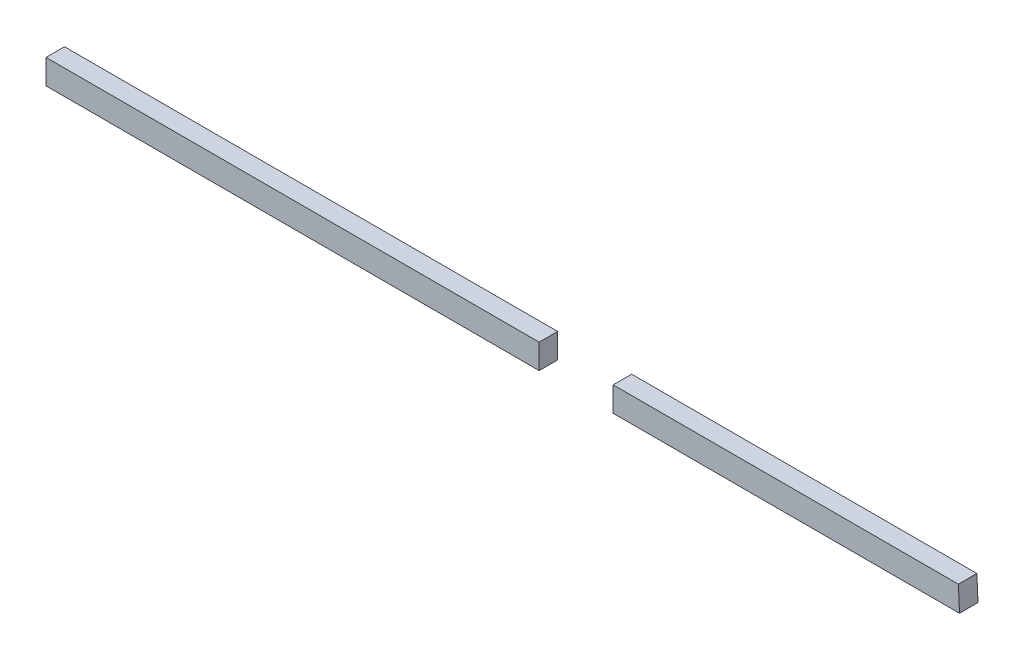
ISO-10303-21;
HEADER;
FILE_DESCRIPTION(('STEP AP214'),'2;1');
FILE_NAME('part.step','',(''),(''),'','','');
FILE_SCHEMA(('AUTOMOTIVE_DESIGN { 1 0 10303 214 1 1 1 1 }'));
ENDSEC;
DATA;
#1=APPLICATION_CONTEXT('core data for automotive mechanical design processes');
#2=APPLICATION_PROTOCOL_DEFINITION('international standard','automotive_design',2000,#1);
#3=PRODUCT_CONTEXT('',#1,'mechanical');
#4=PRODUCT('Part','Part','',(#3));
#5=PRODUCT_RELATED_PRODUCT_CATEGORY('part','',(#4));
#6=PRODUCT_DEFINITION_FORMATION('','',#4);
#7=PRODUCT_DEFINITION_CONTEXT('part definition',#1,'design');
#8=PRODUCT_DEFINITION('design','',#6,#7);
#9=PRODUCT_DEFINITION_SHAPE('','',#8);
#10=(LENGTH_UNIT() NAMED_UNIT(*) SI_UNIT(.MILLI.,.METRE.));
#11=(NAMED_UNIT(*) PLANE_ANGLE_UNIT() SI_UNIT($,.RADIAN.));
#12=(NAMED_UNIT(*) SI_UNIT($,.STERADIAN.) SOLID_ANGLE_UNIT());
#13=UNCERTAINTY_MEASURE_WITH_UNIT(LENGTH_MEASURE(1.E-05),#10,'distance_accuracy_value','');
#14=(GEOMETRIC_REPRESENTATION_CONTEXT(3) GLOBAL_UNCERTAINTY_ASSIGNED_CONTEXT((#13)) GLOBAL_UNIT_ASSIGNED_CONTEXT((#10,
#11,#12)) REPRESENTATION_CONTEXT('',''));
#15=CARTESIAN_POINT('',(0.,0.,0.));
#16=DIRECTION('',(0.,0.,1.));
#17=DIRECTION('',(1.,0.,0.));
#18=AXIS2_PLACEMENT_3D('',#15,#16,#17);
#19=CARTESIAN_POINT('',(-3.54461959474639,10.2044836135278,-1.5));
#20=DIRECTION('',(0.,1.,0.));
#21=DIRECTION('',(0.,0.,1.));
#22=AXIS2_PLACEMENT_3D('',#19,#20,#21);
#23=PLANE('',#22);
#24=DIRECTION('',(-1.,0.,0.));
#25=VECTOR('',#24,1.);
#26=CARTESIAN_POINT('',(-3.54461959474639,10.2044836135278,0.));
#27=LINE('',#26,#25);
#28=CARTESIAN_POINT('',(-3.54461959474639,10.2044836135278,0.));
#29=VERTEX_POINT('',#28);
#30=CARTESIAN_POINT('',(-31.5446195947464,10.2044836135278,0.));
#31=VERTEX_POINT('',#30);
#32=EDGE_CURVE('E106',#29,#31,#27,.T.);
#33=ORIENTED_EDGE('',*,*,#32,.F.);
#34=DIRECTION('',(0.,0.,1.));
#35=VECTOR('',#34,1.);
#36=CARTESIAN_POINT('',(-3.54461959474639,10.2044836135278,-1.5));
#37=LINE('',#36,#35);
#38=CARTESIAN_POINT('',(-3.54461959474639,10.2044836135278,-1.5));
#39=VERTEX_POINT('',#38);
#40=EDGE_CURVE('E12',#39,#29,#37,.T.);
#41=ORIENTED_EDGE('',*,*,#40,.F.);
#42=DIRECTION('',(-1.,0.,0.));
#43=VECTOR('',#42,1.);
#44=CARTESIAN_POINT('',(-3.54461959474639,10.2044836135278,-1.5));
#45=LINE('',#44,#43);
#46=CARTESIAN_POINT('',(-31.5446195947464,10.2044836135278,-1.5));
#47=VERTEX_POINT('',#46);
#48=EDGE_CURVE('E100',#39,#47,#45,.T.);
#49=ORIENTED_EDGE('',*,*,#48,.T.);
#50=DIRECTION('',(0.,0.,1.));
#51=VECTOR('',#50,1.);
#52=CARTESIAN_POINT('',(-31.5446195947464,10.2044836135278,-1.5));
#53=LINE('',#52,#51);
#54=EDGE_CURVE('E45',#47,#31,#53,.T.);
#55=ORIENTED_EDGE('',*,*,#54,.T.);
#56=EDGE_LOOP('',(#33,#41,#49,#55));
#57=FACE_BOUND('',#56,.T.);
#58=ADVANCED_FACE('F42',(#57),#23,.T.);
#59=CARTESIAN_POINT('',(-3.45483620429832,8.20448361352781,-1.5));
#60=DIRECTION('',(0.998993888280604,0.0448465291633645,0.));
#61=DIRECTION('',(-0.0448465291633645,0.998993888280604,0.));
#62=AXIS2_PLACEMENT_3D('',#59,#60,#61);
#63=PLANE('',#62);
#64=DIRECTION('',(-0.0448465291633645,0.998993888280604,0.));
#65=VECTOR('',#64,1.);
#66=CARTESIAN_POINT('',(-3.45483620429832,8.20448361352781,0.));
#67=LINE('',#66,#65);
#68=CARTESIAN_POINT('',(-3.45483620429832,8.20448361352781,0.));
#69=VERTEX_POINT('',#68);
#70=EDGE_CURVE('E102',#69,#29,#67,.T.);
#71=ORIENTED_EDGE('',*,*,#70,.F.);
#72=DIRECTION('',(0.,0.,1.));
#73=VECTOR('',#72,1.);
#74=CARTESIAN_POINT('',(-3.45483620429832,8.20448361352781,-1.5));
#75=LINE('',#74,#73);
#76=CARTESIAN_POINT('',(-3.45483620429832,8.20448361352781,-1.5));
#77=VERTEX_POINT('',#76);
#78=EDGE_CURVE('E51',#77,#69,#75,.T.);
#79=ORIENTED_EDGE('',*,*,#78,.F.);
#80=DIRECTION('',(-0.0448465291633645,0.998993888280604,0.));
#81=VECTOR('',#80,1.);
#82=CARTESIAN_POINT('',(-3.45483620429832,8.20448361352781,-1.5));
#83=LINE('',#82,#81);
#84=EDGE_CURVE('E97',#77,#39,#83,.T.);
#85=ORIENTED_EDGE('',*,*,#84,.T.);
#86=ORIENTED_EDGE('',*,*,#40,.T.);
#87=EDGE_LOOP('',(#71,#79,#85,#86));
#88=FACE_BOUND('',#87,.T.);
#89=ADVANCED_FACE('F116',(#88),#63,.T.);
#90=CARTESIAN_POINT('',(-31.5446195947464,8.20448361352781,-1.5));
#91=DIRECTION('',(0.,-1.,0.));
#92=DIRECTION('',(0.,0.,-1.));
#93=AXIS2_PLACEMENT_3D('',#90,#91,#92);
#94=PLANE('',#93);
#95=DIRECTION('',(1.,0.,0.));
#96=VECTOR('',#95,1.);
#97=CARTESIAN_POINT('',(-31.5446195947464,8.20448361352781,0.));
#98=LINE('',#97,#96);
#99=CARTESIAN_POINT('',(-31.5446195947464,8.20448361352781,0.));
#100=VERTEX_POINT('',#99);
#101=EDGE_CURVE('E92',#100,#69,#98,.T.);
#102=ORIENTED_EDGE('',*,*,#101,.F.);
#103=DIRECTION('',(0.,0.,1.));
#104=VECTOR('',#103,1.);
#105=CARTESIAN_POINT('',(-31.5446195947464,8.20448361352781,-1.5));
#106=LINE('',#105,#104);
#107=CARTESIAN_POINT('',(-31.5446195947464,8.20448361352781,-1.5));
#108=VERTEX_POINT('',#107);
#109=EDGE_CURVE('E87',#108,#100,#106,.T.);
#110=ORIENTED_EDGE('',*,*,#109,.F.);
#111=DIRECTION('',(1.,0.,0.));
#112=VECTOR('',#111,1.);
#113=CARTESIAN_POINT('',(-31.5446195947464,8.20448361352781,-1.5));
#114=LINE('',#113,#112);
#115=EDGE_CURVE('E90',#108,#77,#114,.T.);
#116=ORIENTED_EDGE('',*,*,#115,.T.);
#117=ORIENTED_EDGE('',*,*,#78,.T.);
#118=EDGE_LOOP('',(#102,#110,#116,#117));
#119=FACE_BOUND('',#118,.T.);
#120=ADVANCED_FACE('F89',(#119),#94,.T.);
#121=CARTESIAN_POINT('',(-31.5446195947464,10.2044836135278,-1.5));
#122=DIRECTION('',(-1.,0.,0.));
#123=DIRECTION('',(0.,0.,1.));
#124=AXIS2_PLACEMENT_3D('',#121,#122,#123);
#125=PLANE('',#124);
#126=DIRECTION('',(0.,-1.,0.));
#127=VECTOR('',#126,1.);
#128=CARTESIAN_POINT('',(-31.5446195947464,10.2044836135278,0.));
#129=LINE('',#128,#127);
#130=EDGE_CURVE('E109',#31,#100,#129,.T.);
#131=ORIENTED_EDGE('',*,*,#130,.F.);
#132=ORIENTED_EDGE('',*,*,#54,.F.);
#133=DIRECTION('',(0.,-1.,0.));
#134=VECTOR('',#133,1.);
#135=CARTESIAN_POINT('',(-31.5446195947464,10.2044836135278,-1.5));
#136=LINE('',#135,#134);
#137=EDGE_CURVE('E96',#47,#108,#136,.T.);
#138=ORIENTED_EDGE('',*,*,#137,.T.);
#139=ORIENTED_EDGE('',*,*,#109,.T.);
#140=EDGE_LOOP('',(#131,#132,#138,#139));
#141=FACE_BOUND('',#140,.T.);
#142=ADVANCED_FACE('F99',(#141),#125,.T.);
#143=CARTESIAN_POINT('',(0.,0.,-1.5));
#144=DIRECTION('',(0.,0.,1.));
#145=DIRECTION('',(1.,0.,0.));
#146=AXIS2_PLACEMENT_3D('',#143,#144,#145);
#147=PLANE('',#146);
#148=ORIENTED_EDGE('',*,*,#48,.F.);
#149=ORIENTED_EDGE('',*,*,#84,.F.);
#150=ORIENTED_EDGE('',*,*,#115,.F.);
#151=ORIENTED_EDGE('',*,*,#137,.F.);
#152=EDGE_LOOP('',(#148,#149,#150,#151));
#153=FACE_BOUND('',#152,.T.);
#154=ADVANCED_FACE('F95',(#153),#147,.F.);
#155=CARTESIAN_POINT('',(0.,0.,0.));
#156=DIRECTION('',(0.,0.,1.));
#157=DIRECTION('',(1.,0.,0.));
#158=AXIS2_PLACEMENT_3D('',#155,#156,#157);
#159=PLANE('',#158);
#160=ORIENTED_EDGE('',*,*,#32,.T.);
#161=ORIENTED_EDGE('',*,*,#130,.T.);
#162=ORIENTED_EDGE('',*,*,#101,.T.);
#163=ORIENTED_EDGE('',*,*,#70,.T.);
#164=EDGE_LOOP('',(#160,#161,#162,#163));
#165=FACE_BOUND('',#164,.T.);
#166=ADVANCED_FACE('F115',(#165),#159,.T.);
#167=CLOSED_SHELL('',(#58,#89,#120,#142,#154,#166));
#168=MANIFOLD_SOLID_BREP('B2',#167);
#169=CARTESIAN_POINT('',(-37.5446195947464,8.20448361352781,-1.5));
#170=DIRECTION('',(0.,-1.,0.));
#171=DIRECTION('',(0.,0.,-1.));
#172=AXIS2_PLACEMENT_3D('',#169,#170,#171);
#173=PLANE('',#172);
#174=DIRECTION('',(1.,0.,0.));
#175=VECTOR('',#174,1.);
#176=CARTESIAN_POINT('',(-37.5446195947464,8.20448361352781,0.));
#177=LINE('',#176,#175);
#178=CARTESIAN_POINT('',(-77.5446195947464,8.20448361352781,0.));
#179=VERTEX_POINT('',#178);
#180=CARTESIAN_POINT('',(-37.5446195947464,8.20448361352781,0.));
#181=VERTEX_POINT('',#180);
#182=EDGE_CURVE('E229',#179,#181,#177,.T.);
#183=ORIENTED_EDGE('',*,*,#182,.F.);
#184=DIRECTION('',(0.,0.,1.));
#185=VECTOR('',#184,1.);
#186=CARTESIAN_POINT('',(-77.5446195947464,8.20448361352781,-1.5));
#187=LINE('',#186,#185);
#188=CARTESIAN_POINT('',(-77.5446195947464,8.20448361352781,-1.5));
#189=VERTEX_POINT('',#188);
#190=EDGE_CURVE('E40',#189,#179,#187,.T.);
#191=ORIENTED_EDGE('',*,*,#190,.F.);
#192=DIRECTION('',(1.,0.,0.));
#193=VECTOR('',#192,1.);
#194=CARTESIAN_POINT('',(-37.5446195947464,8.20448361352781,-1.5));
#195=LINE('',#194,#193);
#196=CARTESIAN_POINT('',(-37.5446195947464,8.20448361352781,-1.5));
#197=VERTEX_POINT('',#196);
#198=EDGE_CURVE('E223',#189,#197,#195,.T.);
#199=ORIENTED_EDGE('',*,*,#198,.T.);
#200=DIRECTION('',(0.,0.,1.));
#201=VECTOR('',#200,1.);
#202=CARTESIAN_POINT('',(-37.5446195947464,8.20448361352781,-1.5));
#203=LINE('',#202,#201);
#204=EDGE_CURVE('E168',#197,#181,#203,.T.);
#205=ORIENTED_EDGE('',*,*,#204,.T.);
#206=EDGE_LOOP('',(#183,#191,#199,#205));
#207=FACE_BOUND('',#206,.T.);
#208=ADVANCED_FACE('F165',(#207),#173,.T.);
#209=CARTESIAN_POINT('',(-77.5446195947464,8.20448361352781,-1.5));
#210=DIRECTION('',(-1.,0.,0.));
#211=DIRECTION('',(0.,0.,1.));
#212=AXIS2_PLACEMENT_3D('',#209,#210,#211);
#213=PLANE('',#212);
#214=DIRECTION('',(0.,-1.,0.));
#215=VECTOR('',#214,1.);
#216=CARTESIAN_POINT('',(-77.5446195947464,8.20448361352781,0.));
#217=LINE('',#216,#215);
#218=CARTESIAN_POINT('',(-77.5446195947464,10.2044836135278,0.));
#219=VERTEX_POINT('',#218);
#220=EDGE_CURVE('E225',#219,#179,#217,.T.);
#221=ORIENTED_EDGE('',*,*,#220,.F.);
#222=DIRECTION('',(0.,0.,1.));
#223=VECTOR('',#222,1.);
#224=CARTESIAN_POINT('',(-77.5446195947464,10.2044836135278,-1.5));
#225=LINE('',#224,#223);
#226=CARTESIAN_POINT('',(-77.5446195947464,10.2044836135278,-1.5));
#227=VERTEX_POINT('',#226);
#228=EDGE_CURVE('E174',#227,#219,#225,.T.);
#229=ORIENTED_EDGE('',*,*,#228,.F.);
#230=DIRECTION('',(0.,-1.,0.));
#231=VECTOR('',#230,1.);
#232=CARTESIAN_POINT('',(-77.5446195947464,8.20448361352781,-1.5));
#233=LINE('',#232,#231);
#234=EDGE_CURVE('E220',#227,#189,#233,.T.);
#235=ORIENTED_EDGE('',*,*,#234,.T.);
#236=ORIENTED_EDGE('',*,*,#190,.T.);
#237=EDGE_LOOP('',(#221,#229,#235,#236));
#238=FACE_BOUND('',#237,.T.);
#239=ADVANCED_FACE('F239',(#238),#213,.T.);
#240=CARTESIAN_POINT('',(-77.5446195947464,10.2044836135278,-1.5));
#241=DIRECTION('',(0.,1.,0.));
#242=DIRECTION('',(0.,0.,1.));
#243=AXIS2_PLACEMENT_3D('',#240,#241,#242);
#244=PLANE('',#243);
#245=DIRECTION('',(-1.,0.,0.));
#246=VECTOR('',#245,1.);
#247=CARTESIAN_POINT('',(-77.5446195947464,10.2044836135278,0.));
#248=LINE('',#247,#246);
#249=CARTESIAN_POINT('',(-37.5446195947464,10.2044836135278,0.));
#250=VERTEX_POINT('',#249);
#251=EDGE_CURVE('E215',#250,#219,#248,.T.);
#252=ORIENTED_EDGE('',*,*,#251,.F.);
#253=DIRECTION('',(0.,0.,1.));
#254=VECTOR('',#253,1.);
#255=CARTESIAN_POINT('',(-37.5446195947464,10.2044836135278,-1.5));
#256=LINE('',#255,#254);
#257=CARTESIAN_POINT('',(-37.5446195947464,10.2044836135278,-1.5));
#258=VERTEX_POINT('',#257);
#259=EDGE_CURVE('E210',#258,#250,#256,.T.);
#260=ORIENTED_EDGE('',*,*,#259,.F.);
#261=DIRECTION('',(-1.,0.,0.));
#262=VECTOR('',#261,1.);
#263=CARTESIAN_POINT('',(-77.5446195947464,10.2044836135278,-1.5));
#264=LINE('',#263,#262);
#265=EDGE_CURVE('E213',#258,#227,#264,.T.);
#266=ORIENTED_EDGE('',*,*,#265,.T.);
#267=ORIENTED_EDGE('',*,*,#228,.T.);
#268=EDGE_LOOP('',(#252,#260,#266,#267));
#269=FACE_BOUND('',#268,.T.);
#270=ADVANCED_FACE('F212',(#269),#244,.T.);
#271=CARTESIAN_POINT('',(-37.5446195947464,10.2044836135278,-1.5));
#272=DIRECTION('',(1.,0.,0.));
#273=DIRECTION('',(0.,0.,-1.));
#274=AXIS2_PLACEMENT_3D('',#271,#272,#273);
#275=PLANE('',#274);
#276=DIRECTION('',(0.,1.,0.));
#277=VECTOR('',#276,1.);
#278=CARTESIAN_POINT('',(-37.5446195947464,10.2044836135278,0.));
#279=LINE('',#278,#277);
#280=EDGE_CURVE('E232',#181,#250,#279,.T.);
#281=ORIENTED_EDGE('',*,*,#280,.F.);
#282=ORIENTED_EDGE('',*,*,#204,.F.);
#283=DIRECTION('',(0.,1.,0.));
#284=VECTOR('',#283,1.);
#285=CARTESIAN_POINT('',(-37.5446195947464,10.2044836135278,-1.5));
#286=LINE('',#285,#284);
#287=EDGE_CURVE('E219',#197,#258,#286,.T.);
#288=ORIENTED_EDGE('',*,*,#287,.T.);
#289=ORIENTED_EDGE('',*,*,#259,.T.);
#290=EDGE_LOOP('',(#281,#282,#288,#289));
#291=FACE_BOUND('',#290,.T.);
#292=ADVANCED_FACE('F222',(#291),#275,.T.);
#293=CARTESIAN_POINT('',(0.,0.,-1.5));
#294=DIRECTION('',(0.,0.,-1.));
#295=DIRECTION('',(-1.,0.,0.));
#296=AXIS2_PLACEMENT_3D('',#293,#294,#295);
#297=PLANE('',#296);
#298=ORIENTED_EDGE('',*,*,#198,.F.);
#299=ORIENTED_EDGE('',*,*,#234,.F.);
#300=ORIENTED_EDGE('',*,*,#265,.F.);
#301=ORIENTED_EDGE('',*,*,#287,.F.);
#302=EDGE_LOOP('',(#298,#299,#300,#301));
#303=FACE_BOUND('',#302,.T.);
#304=ADVANCED_FACE('F218',(#303),#297,.T.);
#305=CARTESIAN_POINT('',(0.,0.,0.));
#306=DIRECTION('',(0.,0.,-1.));
#307=DIRECTION('',(-1.,0.,0.));
#308=AXIS2_PLACEMENT_3D('',#305,#306,#307);
#309=PLANE('',#308);
#310=ORIENTED_EDGE('',*,*,#182,.T.);
#311=ORIENTED_EDGE('',*,*,#280,.T.);
#312=ORIENTED_EDGE('',*,*,#251,.T.);
#313=ORIENTED_EDGE('',*,*,#220,.T.);
#314=EDGE_LOOP('',(#310,#311,#312,#313));
#315=FACE_BOUND('',#314,.T.);
#316=ADVANCED_FACE('F238',(#315),#309,.F.);
#317=CLOSED_SHELL('',(#208,#239,#270,#292,#304,#316));
#318=MANIFOLD_SOLID_BREP('B6',#317);
#319=ADVANCED_BREP_SHAPE_REPRESENTATION('',(#18,#168,#318),#14);
#320=SHAPE_DEFINITION_REPRESENTATION(#9,#319);
ENDSEC;
END-ISO-10303-21;
